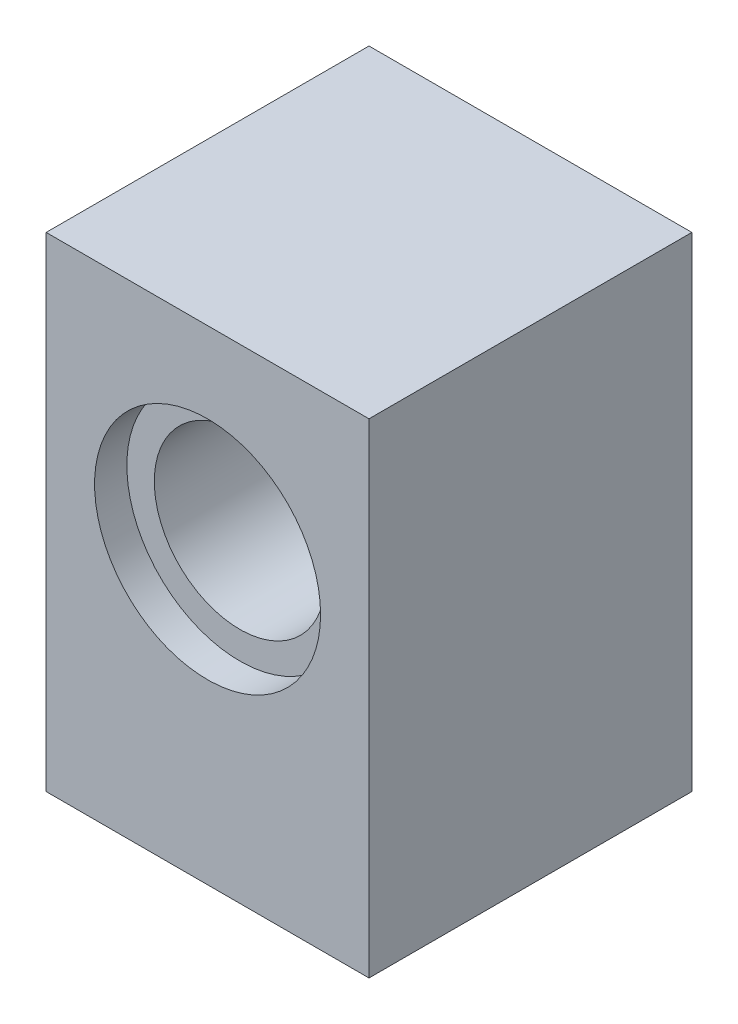
ISO-10303-21;
HEADER;
FILE_DESCRIPTION(('STEP AP214'),'2;1');
FILE_NAME('part.step','',(''),(''),'','','');
FILE_SCHEMA(('AUTOMOTIVE_DESIGN { 1 0 10303 214 1 1 1 1 }'));
ENDSEC;
DATA;
#1=APPLICATION_CONTEXT('core data for automotive mechanical design processes');
#2=APPLICATION_PROTOCOL_DEFINITION('international standard','automotive_design',2000,#1);
#3=PRODUCT_CONTEXT('',#1,'mechanical');
#4=PRODUCT('Part','Part','',(#3));
#5=PRODUCT_RELATED_PRODUCT_CATEGORY('part','',(#4));
#6=PRODUCT_DEFINITION_FORMATION('','',#4);
#7=PRODUCT_DEFINITION_CONTEXT('part definition',#1,'design');
#8=PRODUCT_DEFINITION('design','',#6,#7);
#9=PRODUCT_DEFINITION_SHAPE('','',#8);
#10=(LENGTH_UNIT() NAMED_UNIT(*) SI_UNIT(.MILLI.,.METRE.));
#11=(NAMED_UNIT(*) PLANE_ANGLE_UNIT() SI_UNIT($,.RADIAN.));
#12=(NAMED_UNIT(*) SI_UNIT($,.STERADIAN.) SOLID_ANGLE_UNIT());
#13=UNCERTAINTY_MEASURE_WITH_UNIT(LENGTH_MEASURE(1.E-05),#10,'distance_accuracy_value','');
#14=(GEOMETRIC_REPRESENTATION_CONTEXT(3) GLOBAL_UNCERTAINTY_ASSIGNED_CONTEXT((#13)) GLOBAL_UNIT_ASSIGNED_CONTEXT((#10,
#11,#12)) REPRESENTATION_CONTEXT('',''));
#15=CARTESIAN_POINT('',(0.,0.,0.));
#16=DIRECTION('',(0.,0.,1.));
#17=DIRECTION('',(1.,0.,0.));
#18=AXIS2_PLACEMENT_3D('',#15,#16,#17);
#19=CARTESIAN_POINT('',(0.,15.,0.));
#20=DIRECTION('',(1.,0.,0.));
#21=DIRECTION('',(0.,0.,-1.));
#22=AXIS2_PLACEMENT_3D('',#19,#20,#21);
#23=PLANE('',#22);
#24=DIRECTION('',(0.,0.,1.));
#25=VECTOR('',#24,1.);
#26=CARTESIAN_POINT('',(0.,0.,0.));
#27=LINE('',#26,#25);
#28=CARTESIAN_POINT('',(0.,0.,-10.));
#29=VERTEX_POINT('',#28);
#30=CARTESIAN_POINT('',(0.,0.,0.));
#31=VERTEX_POINT('',#30);
#32=EDGE_CURVE('E96',#29,#31,#27,.T.);
#33=ORIENTED_EDGE('',*,*,#32,.T.);
#34=DIRECTION('',(0.,-1.,0.));
#35=VECTOR('',#34,1.);
#36=CARTESIAN_POINT('',(0.,15.,0.));
#37=LINE('',#36,#35);
#38=CARTESIAN_POINT('',(0.,15.,0.));
#39=VERTEX_POINT('',#38);
#40=EDGE_CURVE('E11',#39,#31,#37,.T.);
#41=ORIENTED_EDGE('',*,*,#40,.F.);
#42=DIRECTION('',(0.,0.,1.));
#43=VECTOR('',#42,1.);
#44=CARTESIAN_POINT('',(0.,15.,0.));
#45=LINE('',#44,#43);
#46=CARTESIAN_POINT('',(0.,15.,-10.));
#47=VERTEX_POINT('',#46);
#48=EDGE_CURVE('E84',#47,#39,#45,.T.);
#49=ORIENTED_EDGE('',*,*,#48,.F.);
#50=DIRECTION('',(0.,-1.,0.));
#51=VECTOR('',#50,1.);
#52=CARTESIAN_POINT('',(0.,15.,-10.));
#53=LINE('',#52,#51);
#54=EDGE_CURVE('E92',#47,#29,#53,.T.);
#55=ORIENTED_EDGE('',*,*,#54,.T.);
#56=EDGE_LOOP('',(#33,#41,#49,#55));
#57=FACE_BOUND('',#56,.T.);
#58=ADVANCED_FACE('F33',(#57),#23,.F.);
#59=CARTESIAN_POINT('',(0.,15.,0.));
#60=DIRECTION('',(0.,0.,-1.));
#61=DIRECTION('',(-1.,0.,0.));
#62=AXIS2_PLACEMENT_3D('',#59,#60,#61);
#63=PLANE('',#62);
#64=CARTESIAN_POINT('',(5.,9.,0.));
#65=DIRECTION('',(0.,0.,1.));
#66=DIRECTION('',(1.,0.,0.));
#67=AXIS2_PLACEMENT_3D('',#64,#65,#66);
#68=CIRCLE('',#67,3.5);
#69=CARTESIAN_POINT('',(8.5,9.,0.));
#70=VERTEX_POINT('',#69);
#71=EDGE_CURVE('E110',#70,#70,#68,.T.);
#72=ORIENTED_EDGE('',*,*,#71,.F.);
#73=EDGE_LOOP('',(#72));
#74=FACE_BOUND('',#73,.T.);
#75=DIRECTION('',(1.,0.,0.));
#76=VECTOR('',#75,1.);
#77=CARTESIAN_POINT('',(0.,0.,0.));
#78=LINE('',#77,#76);
#79=CARTESIAN_POINT('',(10.,0.,0.));
#80=VERTEX_POINT('',#79);
#81=EDGE_CURVE('E88',#31,#80,#78,.T.);
#82=ORIENTED_EDGE('',*,*,#81,.T.);
#83=DIRECTION('',(0.,-1.,0.));
#84=VECTOR('',#83,1.);
#85=CARTESIAN_POINT('',(10.,15.,0.));
#86=LINE('',#85,#84);
#87=CARTESIAN_POINT('',(10.,15.,0.));
#88=VERTEX_POINT('',#87);
#89=EDGE_CURVE('E41',#88,#80,#86,.T.);
#90=ORIENTED_EDGE('',*,*,#89,.F.);
#91=DIRECTION('',(1.,0.,0.));
#92=VECTOR('',#91,1.);
#93=CARTESIAN_POINT('',(0.,15.,0.));
#94=LINE('',#93,#92);
#95=EDGE_CURVE('E79',#39,#88,#94,.T.);
#96=ORIENTED_EDGE('',*,*,#95,.F.);
#97=ORIENTED_EDGE('',*,*,#40,.T.);
#98=EDGE_LOOP('',(#82,#90,#96,#97));
#99=FACE_BOUND('',#98,.T.);
#100=ADVANCED_FACE('F87',(#74,#99),#63,.F.);
#101=CARTESIAN_POINT('',(10.,15.,0.));
#102=DIRECTION('',(-1.,0.,0.));
#103=DIRECTION('',(0.,0.,1.));
#104=AXIS2_PLACEMENT_3D('',#101,#102,#103);
#105=PLANE('',#104);
#106=DIRECTION('',(0.,0.,-1.));
#107=VECTOR('',#106,1.);
#108=CARTESIAN_POINT('',(10.,0.,0.));
#109=LINE('',#108,#107);
#110=CARTESIAN_POINT('',(10.,0.,-10.));
#111=VERTEX_POINT('',#110);
#112=EDGE_CURVE('E66',#80,#111,#109,.T.);
#113=ORIENTED_EDGE('',*,*,#112,.T.);
#114=DIRECTION('',(0.,-1.,0.));
#115=VECTOR('',#114,1.);
#116=CARTESIAN_POINT('',(10.,15.,-10.));
#117=LINE('',#116,#115);
#118=CARTESIAN_POINT('',(10.,15.,-10.));
#119=VERTEX_POINT('',#118);
#120=EDGE_CURVE('E89',#119,#111,#117,.T.);
#121=ORIENTED_EDGE('',*,*,#120,.F.);
#122=DIRECTION('',(0.,0.,-1.));
#123=VECTOR('',#122,1.);
#124=CARTESIAN_POINT('',(10.,15.,0.));
#125=LINE('',#124,#123);
#126=EDGE_CURVE('E82',#88,#119,#125,.T.);
#127=ORIENTED_EDGE('',*,*,#126,.F.);
#128=ORIENTED_EDGE('',*,*,#89,.T.);
#129=EDGE_LOOP('',(#113,#121,#127,#128));
#130=FACE_BOUND('',#129,.T.);
#131=ADVANCED_FACE('F90',(#130),#105,.F.);
#132=CARTESIAN_POINT('',(0.,15.,-10.));
#133=DIRECTION('',(0.,0.,1.));
#134=DIRECTION('',(1.,0.,0.));
#135=AXIS2_PLACEMENT_3D('',#132,#133,#134);
#136=PLANE('',#135);
#137=CARTESIAN_POINT('',(5.,9.,-10.));
#138=DIRECTION('',(0.,0.,1.));
#139=DIRECTION('',(1.,0.,0.));
#140=AXIS2_PLACEMENT_3D('',#137,#138,#139);
#141=CIRCLE('',#140,0.750000000000001);
#142=CARTESIAN_POINT('',(5.75,9.,-10.));
#143=VERTEX_POINT('',#142);
#144=EDGE_CURVE('E119',#143,#143,#141,.T.);
#145=ORIENTED_EDGE('',*,*,#144,.T.);
#146=EDGE_LOOP('',(#145));
#147=FACE_BOUND('',#146,.T.);
#148=DIRECTION('',(-1.,0.,0.));
#149=VECTOR('',#148,1.);
#150=CARTESIAN_POINT('',(0.,0.,-10.));
#151=LINE('',#150,#149);
#152=EDGE_CURVE('E72',#111,#29,#151,.T.);
#153=ORIENTED_EDGE('',*,*,#152,.T.);
#154=ORIENTED_EDGE('',*,*,#54,.F.);
#155=DIRECTION('',(-1.,0.,0.));
#156=VECTOR('',#155,1.);
#157=CARTESIAN_POINT('',(0.,15.,-10.));
#158=LINE('',#157,#156);
#159=EDGE_CURVE('E49',#119,#47,#158,.T.);
#160=ORIENTED_EDGE('',*,*,#159,.F.);
#161=ORIENTED_EDGE('',*,*,#120,.T.);
#162=EDGE_LOOP('',(#153,#154,#160,#161));
#163=FACE_BOUND('',#162,.T.);
#164=ADVANCED_FACE('F104',(#147,#163),#136,.F.);
#165=CARTESIAN_POINT('',(0.,15.,0.));
#166=DIRECTION('',(0.,-1.,0.));
#167=DIRECTION('',(0.,0.,-1.));
#168=AXIS2_PLACEMENT_3D('',#165,#166,#167);
#169=PLANE('',#168);
#170=ORIENTED_EDGE('',*,*,#48,.T.);
#171=ORIENTED_EDGE('',*,*,#95,.T.);
#172=ORIENTED_EDGE('',*,*,#126,.T.);
#173=ORIENTED_EDGE('',*,*,#159,.T.);
#174=EDGE_LOOP('',(#170,#171,#172,#173));
#175=FACE_BOUND('',#174,.T.);
#176=ADVANCED_FACE('F80',(#175),#169,.F.);
#177=CARTESIAN_POINT('',(0.,0.,0.));
#178=DIRECTION('',(0.,-1.,0.));
#179=DIRECTION('',(0.,0.,-1.));
#180=AXIS2_PLACEMENT_3D('',#177,#178,#179);
#181=PLANE('',#180);
#182=ORIENTED_EDGE('',*,*,#32,.F.);
#183=ORIENTED_EDGE('',*,*,#152,.F.);
#184=ORIENTED_EDGE('',*,*,#112,.F.);
#185=ORIENTED_EDGE('',*,*,#81,.F.);
#186=EDGE_LOOP('',(#182,#183,#184,#185));
#187=FACE_BOUND('',#186,.T.);
#188=ADVANCED_FACE('F107',(#187),#181,.T.);
#189=CARTESIAN_POINT('',(5.,9.,-1.));
#190=DIRECTION('',(0.,0.,1.));
#191=DIRECTION('',(1.,0.,0.));
#192=AXIS2_PLACEMENT_3D('',#189,#190,#191);
#193=CYLINDRICAL_SURFACE('',#192,3.5);
#194=CARTESIAN_POINT('',(5.,9.,-1.));
#195=DIRECTION('',(0.,0.,1.));
#196=DIRECTION('',(1.,0.,0.));
#197=AXIS2_PLACEMENT_3D('',#194,#195,#196);
#198=CIRCLE('',#197,3.5);
#199=CARTESIAN_POINT('',(8.5,9.,-1.));
#200=VERTEX_POINT('',#199);
#201=EDGE_CURVE('E99',#200,#200,#198,.T.);
#202=ORIENTED_EDGE('',*,*,#201,.F.);
#203=EDGE_LOOP('',(#202));
#204=FACE_BOUND('',#203,.T.);
#205=ORIENTED_EDGE('',*,*,#71,.T.);
#206=EDGE_LOOP('',(#205));
#207=FACE_BOUND('',#206,.T.);
#208=ADVANCED_FACE('F150',(#204,#207),#193,.F.);
#209=CARTESIAN_POINT('',(5.,9.,-1.));
#210=DIRECTION('',(0.,0.,1.));
#211=DIRECTION('',(1.,0.,0.));
#212=AXIS2_PLACEMENT_3D('',#209,#210,#211);
#213=PLANE('',#212);
#214=CARTESIAN_POINT('',(5.,9.,-1.));
#215=DIRECTION('',(0.,0.,1.));
#216=DIRECTION('',(1.,0.,0.));
#217=AXIS2_PLACEMENT_3D('',#214,#215,#216);
#218=CIRCLE('',#217,2.65);
#219=CARTESIAN_POINT('',(7.65,9.,-1.));
#220=VERTEX_POINT('',#219);
#221=EDGE_CURVE('E116',#220,#220,#218,.T.);
#222=ORIENTED_EDGE('',*,*,#221,.F.);
#223=EDGE_LOOP('',(#222));
#224=FACE_BOUND('',#223,.T.);
#225=ORIENTED_EDGE('',*,*,#201,.T.);
#226=EDGE_LOOP('',(#225));
#227=FACE_BOUND('',#226,.T.);
#228=ADVANCED_FACE('F144',(#224,#227),#213,.T.);
#229=CARTESIAN_POINT('',(5.,9.,-8.9));
#230=DIRECTION('',(0.,0.,1.));
#231=DIRECTION('',(1.,0.,0.));
#232=AXIS2_PLACEMENT_3D('',#229,#230,#231);
#233=CYLINDRICAL_SURFACE('',#232,2.65);
#234=CARTESIAN_POINT('',(5.,9.,-8.9));
#235=DIRECTION('',(0.,0.,1.));
#236=DIRECTION('',(1.,0.,0.));
#237=AXIS2_PLACEMENT_3D('',#234,#235,#236);
#238=CIRCLE('',#237,2.65);
#239=CARTESIAN_POINT('',(7.65,9.,-8.9));
#240=VERTEX_POINT('',#239);
#241=EDGE_CURVE('E113',#240,#240,#238,.T.);
#242=ORIENTED_EDGE('',*,*,#241,.F.);
#243=EDGE_LOOP('',(#242));
#244=FACE_BOUND('',#243,.T.);
#245=ORIENTED_EDGE('',*,*,#221,.T.);
#246=EDGE_LOOP('',(#245));
#247=FACE_BOUND('',#246,.T.);
#248=ADVANCED_FACE('F138',(#244,#247),#233,.F.);
#249=CARTESIAN_POINT('',(5.,9.,-8.9));
#250=DIRECTION('',(0.,0.,1.));
#251=DIRECTION('',(1.,0.,0.));
#252=AXIS2_PLACEMENT_3D('',#249,#250,#251);
#253=PLANE('',#252);
#254=CARTESIAN_POINT('',(5.,9.,-8.9));
#255=DIRECTION('',(0.,0.,1.));
#256=DIRECTION('',(1.,0.,0.));
#257=AXIS2_PLACEMENT_3D('',#254,#255,#256);
#258=CIRCLE('',#257,0.750000000000001);
#259=CARTESIAN_POINT('',(5.75,9.,-8.9));
#260=VERTEX_POINT('',#259);
#261=EDGE_CURVE('E122',#260,#260,#258,.T.);
#262=ORIENTED_EDGE('',*,*,#261,.F.);
#263=EDGE_LOOP('',(#262));
#264=FACE_BOUND('',#263,.T.);
#265=ORIENTED_EDGE('',*,*,#241,.T.);
#266=EDGE_LOOP('',(#265));
#267=FACE_BOUND('',#266,.T.);
#268=ADVANCED_FACE('F132',(#264,#267),#253,.T.);
#269=CARTESIAN_POINT('',(5.,9.,-10.));
#270=DIRECTION('',(0.,0.,1.));
#271=DIRECTION('',(1.,0.,0.));
#272=AXIS2_PLACEMENT_3D('',#269,#270,#271);
#273=CYLINDRICAL_SURFACE('',#272,0.750000000000001);
#274=ORIENTED_EDGE('',*,*,#144,.F.);
#275=EDGE_LOOP('',(#274));
#276=FACE_BOUND('',#275,.T.);
#277=ORIENTED_EDGE('',*,*,#261,.T.);
#278=EDGE_LOOP('',(#277));
#279=FACE_BOUND('',#278,.T.);
#280=ADVANCED_FACE('F129',(#276,#279),#273,.F.);
#281=CLOSED_SHELL('',(#58,#100,#131,#164,#176,#188,#208,#228,#248,#268,#280));
#282=MANIFOLD_SOLID_BREP('B2',#281);
#283=ADVANCED_BREP_SHAPE_REPRESENTATION('',(#18,#282),#14);
#284=SHAPE_DEFINITION_REPRESENTATION(#9,#283);
ENDSEC;
END-ISO-10303-21;
